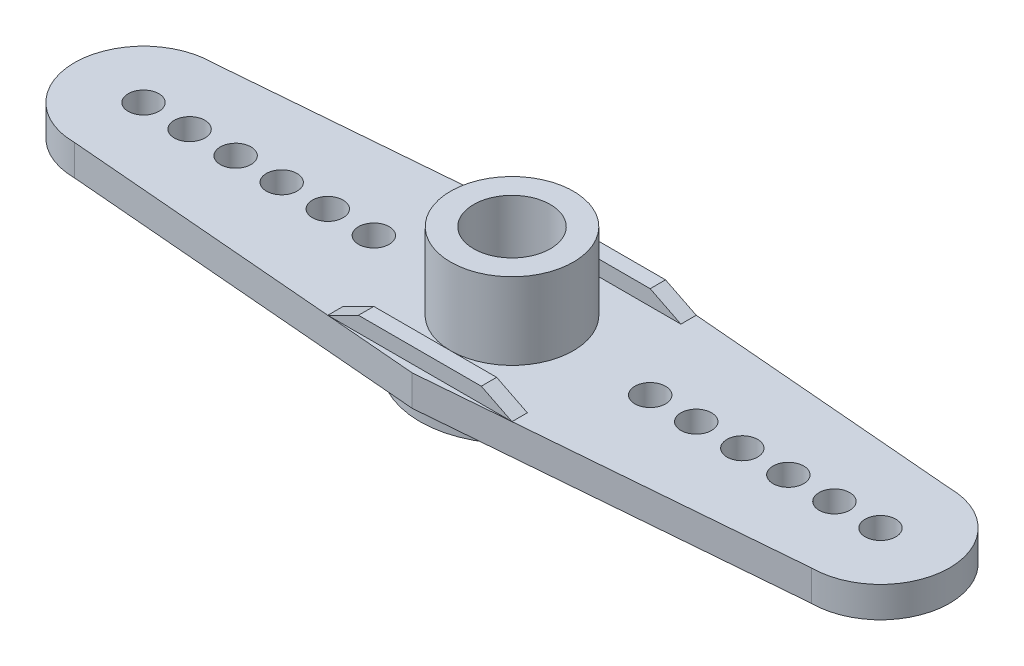
ISO-10303-21;
HEADER;
FILE_DESCRIPTION(('STEP AP214'),'2;1');
FILE_NAME('part.step','',(''),(''),'','','');
FILE_SCHEMA(('AUTOMOTIVE_DESIGN { 1 0 10303 214 1 1 1 1 }'));
ENDSEC;
DATA;
#1=APPLICATION_CONTEXT('core data for automotive mechanical design processes');
#2=APPLICATION_PROTOCOL_DEFINITION('international standard','automotive_design',2000,#1);
#3=PRODUCT_CONTEXT('',#1,'mechanical');
#4=PRODUCT('Part','Part','',(#3));
#5=PRODUCT_RELATED_PRODUCT_CATEGORY('part','',(#4));
#6=PRODUCT_DEFINITION_FORMATION('','',#4);
#7=PRODUCT_DEFINITION_CONTEXT('part definition',#1,'design');
#8=PRODUCT_DEFINITION('design','',#6,#7);
#9=PRODUCT_DEFINITION_SHAPE('','',#8);
#10=(LENGTH_UNIT() NAMED_UNIT(*) SI_UNIT(.MILLI.,.METRE.));
#11=(NAMED_UNIT(*) PLANE_ANGLE_UNIT() SI_UNIT($,.RADIAN.));
#12=(NAMED_UNIT(*) SI_UNIT($,.STERADIAN.) SOLID_ANGLE_UNIT());
#13=UNCERTAINTY_MEASURE_WITH_UNIT(LENGTH_MEASURE(1.E-05),#10,'distance_accuracy_value','');
#14=(GEOMETRIC_REPRESENTATION_CONTEXT(3) GLOBAL_UNCERTAINTY_ASSIGNED_CONTEXT((#13)) GLOBAL_UNIT_ASSIGNED_CONTEXT((#10,
#11,#12)) REPRESENTATION_CONTEXT('',''));
#15=CARTESIAN_POINT('',(0.,0.,0.));
#16=DIRECTION('',(0.,0.,1.));
#17=DIRECTION('',(1.,0.,0.));
#18=AXIS2_PLACEMENT_3D('',#15,#16,#17);
#19=CARTESIAN_POINT('',(0.,2.,0.));
#20=DIRECTION('',(0.,1.,0.));
#21=DIRECTION('',(0.,0.,1.));
#22=AXIS2_PLACEMENT_3D('',#19,#20,#21);
#23=PLANE('',#22);
#24=DIRECTION('',(-0.99654575824488,0.,0.08304547985374));
#25=VECTOR('',#24,1.);
#26=CARTESIAN_POINT('',(0.537931034482759,2.,6.4551724137931));
#27=LINE('',#26,#25);
#28=CARTESIAN_POINT('',(6.,2.,6.));
#29=VERTEX_POINT('',#28);
#30=CARTESIAN_POINT('',(0.,2.,6.5));
#31=VERTEX_POINT('',#30);
#32=EDGE_CURVE('E166',#29,#31,#27,.T.);
#33=ORIENTED_EDGE('',*,*,#32,.F.);
#34=DIRECTION('',(1.,0.,0.));
#35=VECTOR('',#34,1.);
#36=CARTESIAN_POINT('',(-6.,2.,6.));
#37=LINE('',#36,#35);
#38=CARTESIAN_POINT('',(-6.,2.,6.));
#39=VERTEX_POINT('',#38);
#40=EDGE_CURVE('E154',#39,#29,#37,.T.);
#41=ORIENTED_EDGE('',*,*,#40,.F.);
#42=DIRECTION('',(0.99654575824488,0.,0.08304547985374));
#43=VECTOR('',#42,1.);
#44=CARTESIAN_POINT('',(-0.537931034482759,2.,6.4551724137931));
#45=LINE('',#44,#43);
#46=EDGE_CURVE('E164',#39,#31,#45,.T.);
#47=ORIENTED_EDGE('',*,*,#46,.T.);
#48=EDGE_LOOP('',(#33,#41,#47));
#49=FACE_BOUND('',#48,.T.);
#50=ADVANCED_FACE('F35',(#49),#23,.T.);
#51=DIRECTION('',(0.,0.,1.));
#52=VECTOR('',#51,1.);
#53=CARTESIAN_POINT('',(-6.,2.,6.));
#54=LINE('',#53,#52);
#55=CARTESIAN_POINT('',(-6.,2.,5.));
#56=VERTEX_POINT('',#55);
#57=EDGE_CURVE('E134',#56,#39,#54,.T.);
#58=ORIENTED_EDGE('',*,*,#57,.F.);
#59=DIRECTION('',(-1.,0.,0.));
#60=VECTOR('',#59,1.);
#61=CARTESIAN_POINT('',(-6.,2.,5.));
#62=LINE('',#61,#60);
#63=CARTESIAN_POINT('',(6.,2.,5.));
#64=VERTEX_POINT('',#63);
#65=EDGE_CURVE('E146',#64,#56,#62,.T.);
#66=ORIENTED_EDGE('',*,*,#65,.F.);
#67=DIRECTION('',(0.,0.,-1.));
#68=VECTOR('',#67,1.);
#69=CARTESIAN_POINT('',(6.,2.,6.));
#70=LINE('',#69,#68);
#71=EDGE_CURVE('E168',#29,#64,#70,.T.);
#72=ORIENTED_EDGE('',*,*,#71,.F.);
#73=CARTESIAN_POINT('',(24.,2.,4.5));
#74=VERTEX_POINT('',#73);
#75=EDGE_CURVE('E186',#74,#29,#27,.T.);
#76=ORIENTED_EDGE('',*,*,#75,.F.);
#77=CARTESIAN_POINT('',(24.,2.,0.));
#78=DIRECTION('',(0.,1.,0.));
#79=DIRECTION('',(0.,0.,1.));
#80=AXIS2_PLACEMENT_3D('',#77,#78,#79);
#81=CIRCLE('',#80,4.5);
#82=CARTESIAN_POINT('',(24.,2.,-4.5));
#83=VERTEX_POINT('',#82);
#84=EDGE_CURVE('E191',#74,#83,#81,.T.);
#85=ORIENTED_EDGE('',*,*,#84,.T.);
#86=DIRECTION('',(0.99654575824488,0.,0.08304547985374));
#87=VECTOR('',#86,1.);
#88=CARTESIAN_POINT('',(0.537931034482759,2.,-6.4551724137931));
#89=LINE('',#88,#87);
#90=CARTESIAN_POINT('',(6.,2.,-6.));
#91=VERTEX_POINT('',#90);
#92=EDGE_CURVE('E194',#91,#83,#89,.T.);
#93=ORIENTED_EDGE('',*,*,#92,.F.);
#94=DIRECTION('',(0.,0.,-1.));
#95=VECTOR('',#94,1.);
#96=CARTESIAN_POINT('',(6.,2.,-6.));
#97=LINE('',#96,#95);
#98=CARTESIAN_POINT('',(6.,2.,-5.));
#99=VERTEX_POINT('',#98);
#100=EDGE_CURVE('E340',#99,#91,#97,.T.);
#101=ORIENTED_EDGE('',*,*,#100,.F.);
#102=DIRECTION('',(1.,0.,0.));
#103=VECTOR('',#102,1.);
#104=CARTESIAN_POINT('',(-6.,2.,-5.));
#105=LINE('',#104,#103);
#106=CARTESIAN_POINT('',(-6.,2.,-5.));
#107=VERTEX_POINT('',#106);
#108=EDGE_CURVE('E337',#107,#99,#105,.T.);
#109=ORIENTED_EDGE('',*,*,#108,.F.);
#110=DIRECTION('',(0.,0.,1.));
#111=VECTOR('',#110,1.);
#112=CARTESIAN_POINT('',(-6.,2.,-6.));
#113=LINE('',#112,#111);
#114=CARTESIAN_POINT('',(-6.,2.,-6.));
#115=VERTEX_POINT('',#114);
#116=EDGE_CURVE('E321',#115,#107,#113,.T.);
#117=ORIENTED_EDGE('',*,*,#116,.F.);
#118=DIRECTION('',(0.99654575824488,0.,-0.08304547985374));
#119=VECTOR('',#118,1.);
#120=CARTESIAN_POINT('',(-0.537931034482759,2.,-6.4551724137931));
#121=LINE('',#120,#119);
#122=CARTESIAN_POINT('',(-24.,2.,-4.5));
#123=VERTEX_POINT('',#122);
#124=EDGE_CURVE('E199',#123,#115,#121,.T.);
#125=ORIENTED_EDGE('',*,*,#124,.F.);
#126=CARTESIAN_POINT('',(-24.,2.,0.));
#127=DIRECTION('',(0.,1.,0.));
#128=DIRECTION('',(0.,0.,1.));
#129=AXIS2_PLACEMENT_3D('',#126,#127,#128);
#130=CIRCLE('',#129,4.5);
#131=CARTESIAN_POINT('',(-24.,2.,4.5));
#132=VERTEX_POINT('',#131);
#133=EDGE_CURVE('E184',#123,#132,#130,.T.);
#134=ORIENTED_EDGE('',*,*,#133,.T.);
#135=EDGE_CURVE('E176',#132,#39,#45,.T.);
#136=ORIENTED_EDGE('',*,*,#135,.T.);
#137=EDGE_LOOP('',(#58,#66,#72,#76,#85,#93,#101,#109,#117,#125,#134,#136));
#138=FACE_BOUND('',#137,.T.);
#139=CARTESIAN_POINT('',(-12.,2.,0.));
#140=DIRECTION('',(0.,1.,0.));
#141=DIRECTION('',(0.,0.,1.));
#142=AXIS2_PLACEMENT_3D('',#139,#140,#141);
#143=CIRCLE('',#142,1.);
#144=CARTESIAN_POINT('',(-12.,2.,1.00000000000009));
#145=VERTEX_POINT('',#144);
#146=EDGE_CURVE('E287',#145,#145,#143,.F.);
#147=ORIENTED_EDGE('',*,*,#146,.T.);
#148=EDGE_LOOP('',(#147));
#149=FACE_BOUND('',#148,.T.);
#150=CARTESIAN_POINT('',(-18.,2.,0.));
#151=DIRECTION('',(0.,1.,0.));
#152=DIRECTION('',(0.,0.,1.));
#153=AXIS2_PLACEMENT_3D('',#150,#151,#152);
#154=CIRCLE('',#153,0.999999999999998);
#155=CARTESIAN_POINT('',(-18.,2.,1.00000000000004));
#156=VERTEX_POINT('',#155);
#157=EDGE_CURVE('E365',#156,#156,#154,.F.);
#158=ORIENTED_EDGE('',*,*,#157,.T.);
#159=EDGE_LOOP('',(#158));
#160=FACE_BOUND('',#159,.T.);
#161=CARTESIAN_POINT('',(-24.,2.,0.));
#162=DIRECTION('',(0.,1.,0.));
#163=DIRECTION('',(0.,0.,1.));
#164=AXIS2_PLACEMENT_3D('',#161,#162,#163);
#165=CIRCLE('',#164,0.999999999999995);
#166=CARTESIAN_POINT('',(-24.,2.,0.999999999999995));
#167=VERTEX_POINT('',#166);
#168=EDGE_CURVE('E178',#167,#167,#165,.F.);
#169=ORIENTED_EDGE('',*,*,#168,.T.);
#170=EDGE_LOOP('',(#169));
#171=FACE_BOUND('',#170,.T.);
#172=CARTESIAN_POINT('',(-21.,2.,0.));
#173=DIRECTION('',(0.,1.,0.));
#174=DIRECTION('',(0.,0.,1.));
#175=AXIS2_PLACEMENT_3D('',#172,#173,#174);
#176=CIRCLE('',#175,1.);
#177=CARTESIAN_POINT('',(-21.,2.,1.00000000000002));
#178=VERTEX_POINT('',#177);
#179=EDGE_CURVE('E203',#178,#178,#176,.F.);
#180=ORIENTED_EDGE('',*,*,#179,.T.);
#181=EDGE_LOOP('',(#180));
#182=FACE_BOUND('',#181,.T.);
#183=CARTESIAN_POINT('',(-15.,2.,0.));
#184=DIRECTION('',(0.,1.,0.));
#185=DIRECTION('',(0.,0.,1.));
#186=AXIS2_PLACEMENT_3D('',#183,#184,#185);
#187=CIRCLE('',#186,1.);
#188=CARTESIAN_POINT('',(-15.,2.,1.00000000000006));
#189=VERTEX_POINT('',#188);
#190=EDGE_CURVE('E206',#189,#189,#187,.F.);
#191=ORIENTED_EDGE('',*,*,#190,.T.);
#192=EDGE_LOOP('',(#191));
#193=FACE_BOUND('',#192,.T.);
#194=CARTESIAN_POINT('',(-8.99999999999999,2.,1.04744440165294E-13));
#195=DIRECTION('',(0.,1.,0.));
#196=DIRECTION('',(0.,0.,1.));
#197=AXIS2_PLACEMENT_3D('',#194,#195,#196);
#198=CIRCLE('',#197,1.);
#199=CARTESIAN_POINT('',(-8.99999999999999,2.,1.00000000000011));
#200=VERTEX_POINT('',#199);
#201=EDGE_CURVE('E209',#200,#200,#198,.F.);
#202=ORIENTED_EDGE('',*,*,#201,.T.);
#203=EDGE_LOOP('',(#202));
#204=FACE_BOUND('',#203,.T.);
#205=CARTESIAN_POINT('',(24.,2.,0.));
#206=DIRECTION('',(0.,1.,0.));
#207=DIRECTION('',(0.,0.,1.));
#208=AXIS2_PLACEMENT_3D('',#205,#206,#207);
#209=CIRCLE('',#208,1.);
#210=CARTESIAN_POINT('',(24.,2.,1.));
#211=VERTEX_POINT('',#210);
#212=EDGE_CURVE('E230',#211,#211,#209,.T.);
#213=ORIENTED_EDGE('',*,*,#212,.F.);
#214=EDGE_LOOP('',(#213));
#215=FACE_BOUND('',#214,.T.);
#216=CARTESIAN_POINT('',(21.,2.,0.));
#217=DIRECTION('',(0.,1.,0.));
#218=DIRECTION('',(0.,0.,1.));
#219=AXIS2_PLACEMENT_3D('',#216,#217,#218);
#220=CIRCLE('',#219,1.);
#221=CARTESIAN_POINT('',(21.,2.,1.00000000000002));
#222=VERTEX_POINT('',#221);
#223=EDGE_CURVE('E227',#222,#222,#220,.T.);
#224=ORIENTED_EDGE('',*,*,#223,.F.);
#225=EDGE_LOOP('',(#224));
#226=FACE_BOUND('',#225,.T.);
#227=CARTESIAN_POINT('',(18.,2.,0.));
#228=DIRECTION('',(0.,1.,0.));
#229=DIRECTION('',(0.,0.,1.));
#230=AXIS2_PLACEMENT_3D('',#227,#228,#229);
#231=CIRCLE('',#230,0.999999999999998);
#232=CARTESIAN_POINT('',(18.,2.,1.00000000000004));
#233=VERTEX_POINT('',#232);
#234=EDGE_CURVE('E224',#233,#233,#231,.T.);
#235=ORIENTED_EDGE('',*,*,#234,.F.);
#236=EDGE_LOOP('',(#235));
#237=FACE_BOUND('',#236,.T.);
#238=CARTESIAN_POINT('',(15.,2.,0.));
#239=DIRECTION('',(0.,1.,0.));
#240=DIRECTION('',(0.,0.,1.));
#241=AXIS2_PLACEMENT_3D('',#238,#239,#240);
#242=CIRCLE('',#241,1.);
#243=CARTESIAN_POINT('',(15.,2.,1.00000000000006));
#244=VERTEX_POINT('',#243);
#245=EDGE_CURVE('E221',#244,#244,#242,.T.);
#246=ORIENTED_EDGE('',*,*,#245,.F.);
#247=EDGE_LOOP('',(#246));
#248=FACE_BOUND('',#247,.T.);
#249=CARTESIAN_POINT('',(12.,2.,0.));
#250=DIRECTION('',(0.,1.,0.));
#251=DIRECTION('',(0.,0.,1.));
#252=AXIS2_PLACEMENT_3D('',#249,#250,#251);
#253=CIRCLE('',#252,1.);
#254=CARTESIAN_POINT('',(12.,2.,1.00000000000009));
#255=VERTEX_POINT('',#254);
#256=EDGE_CURVE('E218',#255,#255,#253,.T.);
#257=ORIENTED_EDGE('',*,*,#256,.F.);
#258=EDGE_LOOP('',(#257));
#259=FACE_BOUND('',#258,.T.);
#260=CARTESIAN_POINT('',(8.99999999999999,2.,1.04744440165294E-13));
#261=DIRECTION('',(0.,1.,0.));
#262=DIRECTION('',(0.,0.,1.));
#263=AXIS2_PLACEMENT_3D('',#260,#261,#262);
#264=CIRCLE('',#263,1.);
#265=CARTESIAN_POINT('',(8.99999999999999,2.,1.00000000000011));
#266=VERTEX_POINT('',#265);
#267=EDGE_CURVE('E215',#266,#266,#264,.T.);
#268=ORIENTED_EDGE('',*,*,#267,.F.);
#269=EDGE_LOOP('',(#268));
#270=FACE_BOUND('',#269,.T.);
#271=CARTESIAN_POINT('',(0.,2.,0.));
#272=DIRECTION('',(0.,1.,0.));
#273=DIRECTION('',(0.,0.,1.));
#274=AXIS2_PLACEMENT_3D('',#271,#272,#273);
#275=CIRCLE('',#274,4.);
#276=CARTESIAN_POINT('',(0.,2.,4.));
#277=VERTEX_POINT('',#276);
#278=EDGE_CURVE('E359',#277,#277,#275,.T.);
#279=ORIENTED_EDGE('',*,*,#278,.F.);
#280=EDGE_LOOP('',(#279));
#281=FACE_BOUND('',#280,.T.);
#282=ADVANCED_FACE('F180',(#138,#149,#160,#171,#182,#193,#204,#215,#226,#237,#248,#259,#270,
#281),#23,.T.);
#283=CARTESIAN_POINT('',(0.,2.,-6.5));
#284=VERTEX_POINT('',#283);
#285=EDGE_CURVE('E198',#115,#284,#121,.T.);
#286=ORIENTED_EDGE('',*,*,#285,.F.);
#287=DIRECTION('',(-1.,0.,0.));
#288=VECTOR('',#287,1.);
#289=CARTESIAN_POINT('',(-6.,2.,-6.));
#290=LINE('',#289,#288);
#291=EDGE_CURVE('E332',#91,#115,#290,.T.);
#292=ORIENTED_EDGE('',*,*,#291,.F.);
#293=EDGE_CURVE('E195',#284,#91,#89,.T.);
#294=ORIENTED_EDGE('',*,*,#293,.F.);
#295=EDGE_LOOP('',(#286,#292,#294));
#296=FACE_BOUND('',#295,.T.);
#297=ADVANCED_FACE('F426',(#296),#23,.T.);
#298=CARTESIAN_POINT('',(0.,2.,0.));
#299=DIRECTION('',(0.,-1.,0.));
#300=DIRECTION('',(0.,0.,-1.));
#301=AXIS2_PLACEMENT_3D('',#298,#299,#300);
#302=CYLINDRICAL_SURFACE('',#301,1.5);
#303=CARTESIAN_POINT('',(0.,2.,0.));
#304=DIRECTION('',(0.,1.,0.));
#305=DIRECTION('',(0.,0.,1.));
#306=AXIS2_PLACEMENT_3D('',#303,#304,#305);
#307=CIRCLE('',#306,1.5);
#308=CARTESIAN_POINT('',(0.,2.,1.5));
#309=VERTEX_POINT('',#308);
#310=EDGE_CURVE('E212',#309,#309,#307,.T.);
#311=ORIENTED_EDGE('',*,*,#310,.T.);
#312=EDGE_LOOP('',(#311));
#313=FACE_BOUND('',#312,.T.);
#314=CARTESIAN_POINT('',(0.,1.,0.));
#315=DIRECTION('',(0.,-1.,0.));
#316=DIRECTION('',(0.,0.,-1.));
#317=AXIS2_PLACEMENT_3D('',#314,#315,#316);
#318=CIRCLE('',#317,1.5);
#319=CARTESIAN_POINT('',(0.,1.,-1.5));
#320=VERTEX_POINT('',#319);
#321=EDGE_CURVE('E304',#320,#320,#318,.T.);
#322=ORIENTED_EDGE('',*,*,#321,.T.);
#323=EDGE_LOOP('',(#322));
#324=FACE_BOUND('',#323,.T.);
#325=ADVANCED_FACE('F437',(#313,#324),#302,.F.);
#326=CARTESIAN_POINT('',(0.,0.,0.));
#327=DIRECTION('',(0.,1.,0.));
#328=DIRECTION('',(0.,0.,1.));
#329=AXIS2_PLACEMENT_3D('',#326,#327,#328);
#330=PLANE('',#329);
#331=CARTESIAN_POINT('',(0.,0.,0.));
#332=DIRECTION('',(0.,-1.,0.));
#333=DIRECTION('',(0.,0.,-1.));
#334=AXIS2_PLACEMENT_3D('',#331,#332,#333);
#335=CIRCLE('',#334,3.5);
#336=CARTESIAN_POINT('',(0.,0.,-3.5));
#337=VERTEX_POINT('',#336);
#338=EDGE_CURVE('E335',#337,#337,#335,.T.);
#339=ORIENTED_EDGE('',*,*,#338,.F.);
#340=EDGE_LOOP('',(#339));
#341=FACE_BOUND('',#340,.T.);
#342=CARTESIAN_POINT('',(0.,0.,0.));
#343=DIRECTION('',(0.,-1.,0.));
#344=DIRECTION('',(0.,0.,-1.));
#345=AXIS2_PLACEMENT_3D('',#342,#343,#344);
#346=CIRCLE('',#345,4.);
#347=CARTESIAN_POINT('',(0.,0.,-4.));
#348=VERTEX_POINT('',#347);
#349=EDGE_CURVE('E306',#348,#348,#346,.T.);
#350=ORIENTED_EDGE('',*,*,#349,.T.);
#351=EDGE_LOOP('',(#350));
#352=FACE_BOUND('',#351,.T.);
#353=ADVANCED_FACE('F389',(#341,#352),#330,.F.);
#354=ORIENTED_EDGE('',*,*,#310,.F.);
#355=EDGE_LOOP('',(#354));
#356=FACE_BOUND('',#355,.T.);
#357=CARTESIAN_POINT('',(0.,2.,0.));
#358=DIRECTION('',(0.,1.,0.));
#359=DIRECTION('',(0.,0.,1.));
#360=AXIS2_PLACEMENT_3D('',#357,#358,#359);
#361=CIRCLE('',#360,2.5);
#362=CARTESIAN_POINT('',(0.,2.,2.5));
#363=VERTEX_POINT('',#362);
#364=EDGE_CURVE('E298',#363,#363,#361,.F.);
#365=ORIENTED_EDGE('',*,*,#364,.F.);
#366=EDGE_LOOP('',(#365));
#367=FACE_BOUND('',#366,.T.);
#368=ADVANCED_FACE('F421',(#356,#367),#23,.T.);
#369=CARTESIAN_POINT('',(-0.537931034482759,2.,6.4551724137931));
#370=DIRECTION('',(0.08304547985374,0.,-0.99654575824488));
#371=DIRECTION('',(-0.99654575824488,0.,-0.08304547985374));
#372=AXIS2_PLACEMENT_3D('',#369,#370,#371);
#373=PLANE('',#372);
#374=DIRECTION('',(0.99654575824488,0.,0.08304547985374));
#375=VECTOR('',#374,1.);
#376=CARTESIAN_POINT('',(-0.537931034482759,0.,6.4551724137931));
#377=LINE('',#376,#375);
#378=CARTESIAN_POINT('',(-24.,0.,4.5));
#379=VERTEX_POINT('',#378);
#380=CARTESIAN_POINT('',(0.,0.,6.5));
#381=VERTEX_POINT('',#380);
#382=EDGE_CURVE('E244',#379,#381,#377,.T.);
#383=ORIENTED_EDGE('',*,*,#382,.T.);
#384=DIRECTION('',(0.,-1.,0.));
#385=VECTOR('',#384,1.);
#386=CARTESIAN_POINT('',(0.,2.,6.5));
#387=LINE('',#386,#385);
#388=EDGE_CURVE('E177',#31,#381,#387,.T.);
#389=ORIENTED_EDGE('',*,*,#388,.F.);
#390=ORIENTED_EDGE('',*,*,#46,.F.);
#391=ORIENTED_EDGE('',*,*,#135,.F.);
#392=DIRECTION('',(0.,-1.,0.));
#393=VECTOR('',#392,1.);
#394=CARTESIAN_POINT('',(-24.,2.,4.5));
#395=LINE('',#394,#393);
#396=EDGE_CURVE('E233',#132,#379,#395,.T.);
#397=ORIENTED_EDGE('',*,*,#396,.T.);
#398=EDGE_LOOP('',(#383,#389,#390,#391,#397));
#399=FACE_BOUND('',#398,.T.);
#400=ADVANCED_FACE('F174',(#399),#373,.F.);
#401=CARTESIAN_POINT('',(0.537931034482759,2.,6.4551724137931));
#402=DIRECTION('',(0.08304547985374,0.,0.99654575824488));
#403=DIRECTION('',(0.99654575824488,0.,-0.08304547985374));
#404=AXIS2_PLACEMENT_3D('',#401,#402,#403);
#405=PLANE('',#404);
#406=DIRECTION('',(-0.99654575824488,0.,0.08304547985374));
#407=VECTOR('',#406,1.);
#408=CARTESIAN_POINT('',(0.537931034482759,0.,6.4551724137931));
#409=LINE('',#408,#407);
#410=CARTESIAN_POINT('',(24.,0.,4.5));
#411=VERTEX_POINT('',#410);
#412=EDGE_CURVE('E246',#411,#381,#409,.T.);
#413=ORIENTED_EDGE('',*,*,#412,.F.);
#414=DIRECTION('',(0.,-1.,0.));
#415=VECTOR('',#414,1.);
#416=CARTESIAN_POINT('',(24.,2.,4.5));
#417=LINE('',#416,#415);
#418=EDGE_CURVE('E295',#74,#411,#417,.T.);
#419=ORIENTED_EDGE('',*,*,#418,.F.);
#420=ORIENTED_EDGE('',*,*,#75,.T.);
#421=ORIENTED_EDGE('',*,*,#32,.T.);
#422=ORIENTED_EDGE('',*,*,#388,.T.);
#423=EDGE_LOOP('',(#413,#419,#420,#421,#422));
#424=FACE_BOUND('',#423,.T.);
#425=ADVANCED_FACE('F435',(#424),#405,.T.);
#426=CARTESIAN_POINT('',(24.,2.,0.));
#427=DIRECTION('',(0.,-1.,0.));
#428=DIRECTION('',(0.,0.,-1.));
#429=AXIS2_PLACEMENT_3D('',#426,#427,#428);
#430=CYLINDRICAL_SURFACE('',#429,4.5);
#431=CARTESIAN_POINT('',(24.,0.,0.));
#432=DIRECTION('',(0.,1.,0.));
#433=DIRECTION('',(0.,0.,1.));
#434=AXIS2_PLACEMENT_3D('',#431,#432,#433);
#435=CIRCLE('',#434,4.5);
#436=CARTESIAN_POINT('',(24.,0.,-4.5));
#437=VERTEX_POINT('',#436);
#438=EDGE_CURVE('E249',#411,#437,#435,.T.);
#439=ORIENTED_EDGE('',*,*,#438,.T.);
#440=DIRECTION('',(0.,-1.,0.));
#441=VECTOR('',#440,1.);
#442=CARTESIAN_POINT('',(24.,2.,-4.5));
#443=LINE('',#442,#441);
#444=EDGE_CURVE('E293',#83,#437,#443,.T.);
#445=ORIENTED_EDGE('',*,*,#444,.F.);
#446=ORIENTED_EDGE('',*,*,#84,.F.);
#447=ORIENTED_EDGE('',*,*,#418,.T.);
#448=EDGE_LOOP('',(#439,#445,#446,#447));
#449=FACE_BOUND('',#448,.T.);
#450=ADVANCED_FACE('F810',(#449),#430,.T.);
#451=CARTESIAN_POINT('',(0.537931034482759,2.,-6.4551724137931));
#452=DIRECTION('',(0.08304547985374,0.,-0.99654575824488));
#453=DIRECTION('',(-0.99654575824488,0.,-0.08304547985374));
#454=AXIS2_PLACEMENT_3D('',#451,#452,#453);
#455=PLANE('',#454);
#456=DIRECTION('',(0.99654575824488,0.,0.08304547985374));
#457=VECTOR('',#456,1.);
#458=CARTESIAN_POINT('',(0.537931034482759,0.,-6.4551724137931));
#459=LINE('',#458,#457);
#460=CARTESIAN_POINT('',(0.,0.,-6.5));
#461=VERTEX_POINT('',#460);
#462=EDGE_CURVE('E252',#461,#437,#459,.T.);
#463=ORIENTED_EDGE('',*,*,#462,.F.);
#464=DIRECTION('',(0.,-1.,0.));
#465=VECTOR('',#464,1.);
#466=CARTESIAN_POINT('',(0.,2.,-6.5));
#467=LINE('',#466,#465);
#468=EDGE_CURVE('E291',#284,#461,#467,.T.);
#469=ORIENTED_EDGE('',*,*,#468,.F.);
#470=ORIENTED_EDGE('',*,*,#293,.T.);
#471=ORIENTED_EDGE('',*,*,#92,.T.);
#472=ORIENTED_EDGE('',*,*,#444,.T.);
#473=EDGE_LOOP('',(#463,#469,#470,#471,#472));
#474=FACE_BOUND('',#473,.T.);
#475=ADVANCED_FACE('F491',(#474),#455,.T.);
#476=CARTESIAN_POINT('',(-0.537931034482759,2.,-6.4551724137931));
#477=DIRECTION('',(-0.08304547985374,0.,-0.99654575824488));
#478=DIRECTION('',(-0.99654575824488,0.,0.08304547985374));
#479=AXIS2_PLACEMENT_3D('',#476,#477,#478);
#480=PLANE('',#479);
#481=DIRECTION('',(0.99654575824488,0.,-0.08304547985374));
#482=VECTOR('',#481,1.);
#483=CARTESIAN_POINT('',(-0.537931034482759,0.,-6.4551724137931));
#484=LINE('',#483,#482);
#485=CARTESIAN_POINT('',(-24.,0.,-4.5));
#486=VERTEX_POINT('',#485);
#487=EDGE_CURVE('E255',#486,#461,#484,.T.);
#488=ORIENTED_EDGE('',*,*,#487,.F.);
#489=DIRECTION('',(0.,-1.,0.));
#490=VECTOR('',#489,1.);
#491=CARTESIAN_POINT('',(-24.,2.,-4.5));
#492=LINE('',#491,#490);
#493=EDGE_CURVE('E289',#123,#486,#492,.T.);
#494=ORIENTED_EDGE('',*,*,#493,.F.);
#495=ORIENTED_EDGE('',*,*,#124,.T.);
#496=ORIENTED_EDGE('',*,*,#285,.T.);
#497=ORIENTED_EDGE('',*,*,#468,.T.);
#498=EDGE_LOOP('',(#488,#494,#495,#496,#497));
#499=FACE_BOUND('',#498,.T.);
#500=ADVANCED_FACE('F455',(#499),#480,.T.);
#501=CARTESIAN_POINT('',(21.,2.,0.));
#502=DIRECTION('',(0.,-1.,0.));
#503=DIRECTION('',(0.,0.,-1.));
#504=AXIS2_PLACEMENT_3D('',#501,#502,#503);
#505=CYLINDRICAL_SURFACE('',#504,1.);
#506=ORIENTED_EDGE('',*,*,#223,.T.);
#507=EDGE_LOOP('',(#506));
#508=FACE_BOUND('',#507,.T.);
#509=CARTESIAN_POINT('',(21.,0.,0.));
#510=DIRECTION('',(0.,1.,0.));
#511=DIRECTION('',(0.,0.,1.));
#512=AXIS2_PLACEMENT_3D('',#509,#510,#511);
#513=CIRCLE('',#512,1.);
#514=CARTESIAN_POINT('',(21.,0.,1.00000000000002));
#515=VERTEX_POINT('',#514);
#516=EDGE_CURVE('E281',#515,#515,#513,.T.);
#517=ORIENTED_EDGE('',*,*,#516,.F.);
#518=EDGE_LOOP('',(#517));
#519=FACE_BOUND('',#518,.T.);
#520=ADVANCED_FACE('F795',(#508,#519),#505,.F.);
#521=CARTESIAN_POINT('',(18.,2.,0.));
#522=DIRECTION('',(0.,-1.,0.));
#523=DIRECTION('',(0.,0.,-1.));
#524=AXIS2_PLACEMENT_3D('',#521,#522,#523);
#525=CYLINDRICAL_SURFACE('',#524,0.999999999999998);
#526=ORIENTED_EDGE('',*,*,#234,.T.);
#527=EDGE_LOOP('',(#526));
#528=FACE_BOUND('',#527,.T.);
#529=CARTESIAN_POINT('',(18.,0.,0.));
#530=DIRECTION('',(0.,1.,0.));
#531=DIRECTION('',(0.,0.,1.));
#532=AXIS2_PLACEMENT_3D('',#529,#530,#531);
#533=CIRCLE('',#532,0.999999999999998);
#534=CARTESIAN_POINT('',(18.,0.,1.00000000000004));
#535=VERTEX_POINT('',#534);
#536=EDGE_CURVE('E278',#535,#535,#533,.T.);
#537=ORIENTED_EDGE('',*,*,#536,.F.);
#538=EDGE_LOOP('',(#537));
#539=FACE_BOUND('',#538,.T.);
#540=ADVANCED_FACE('F785',(#528,#539),#525,.F.);
#541=CARTESIAN_POINT('',(15.,2.,0.));
#542=DIRECTION('',(0.,-1.,0.));
#543=DIRECTION('',(0.,0.,-1.));
#544=AXIS2_PLACEMENT_3D('',#541,#542,#543);
#545=CYLINDRICAL_SURFACE('',#544,1.);
#546=ORIENTED_EDGE('',*,*,#245,.T.);
#547=EDGE_LOOP('',(#546));
#548=FACE_BOUND('',#547,.T.);
#549=CARTESIAN_POINT('',(15.,0.,0.));
#550=DIRECTION('',(0.,1.,0.));
#551=DIRECTION('',(0.,0.,1.));
#552=AXIS2_PLACEMENT_3D('',#549,#550,#551);
#553=CIRCLE('',#552,1.);
#554=CARTESIAN_POINT('',(15.,0.,1.00000000000006));
#555=VERTEX_POINT('',#554);
#556=EDGE_CURVE('E275',#555,#555,#553,.T.);
#557=ORIENTED_EDGE('',*,*,#556,.F.);
#558=EDGE_LOOP('',(#557));
#559=FACE_BOUND('',#558,.T.);
#560=ADVANCED_FACE('F775',(#548,#559),#545,.F.);
#561=CARTESIAN_POINT('',(12.,2.,0.));
#562=DIRECTION('',(0.,-1.,0.));
#563=DIRECTION('',(0.,0.,-1.));
#564=AXIS2_PLACEMENT_3D('',#561,#562,#563);
#565=CYLINDRICAL_SURFACE('',#564,1.);
#566=ORIENTED_EDGE('',*,*,#256,.T.);
#567=EDGE_LOOP('',(#566));
#568=FACE_BOUND('',#567,.T.);
#569=CARTESIAN_POINT('',(12.,0.,0.));
#570=DIRECTION('',(0.,1.,0.));
#571=DIRECTION('',(0.,0.,1.));
#572=AXIS2_PLACEMENT_3D('',#569,#570,#571);
#573=CIRCLE('',#572,1.);
#574=CARTESIAN_POINT('',(12.,0.,1.00000000000009));
#575=VERTEX_POINT('',#574);
#576=EDGE_CURVE('E272',#575,#575,#573,.T.);
#577=ORIENTED_EDGE('',*,*,#576,.F.);
#578=EDGE_LOOP('',(#577));
#579=FACE_BOUND('',#578,.T.);
#580=ADVANCED_FACE('F765',(#568,#579),#565,.F.);
#581=CARTESIAN_POINT('',(8.99999999999999,2.,1.04744440165294E-13));
#582=DIRECTION('',(0.,-1.,0.));
#583=DIRECTION('',(0.,0.,-1.));
#584=AXIS2_PLACEMENT_3D('',#581,#582,#583);
#585=CYLINDRICAL_SURFACE('',#584,1.);
#586=ORIENTED_EDGE('',*,*,#267,.T.);
#587=EDGE_LOOP('',(#586));
#588=FACE_BOUND('',#587,.T.);
#589=CARTESIAN_POINT('',(8.99999999999999,0.,1.04744440165294E-13));
#590=DIRECTION('',(0.,1.,0.));
#591=DIRECTION('',(0.,0.,1.));
#592=AXIS2_PLACEMENT_3D('',#589,#590,#591);
#593=CIRCLE('',#592,1.);
#594=CARTESIAN_POINT('',(8.99999999999999,0.,1.00000000000011));
#595=VERTEX_POINT('',#594);
#596=EDGE_CURVE('E269',#595,#595,#593,.T.);
#597=ORIENTED_EDGE('',*,*,#596,.F.);
#598=EDGE_LOOP('',(#597));
#599=FACE_BOUND('',#598,.T.);
#600=ADVANCED_FACE('F755',(#588,#599),#585,.F.);
#601=CARTESIAN_POINT('',(-8.99999999999999,2.,1.04744440165294E-13));
#602=DIRECTION('',(0.,-1.,0.));
#603=DIRECTION('',(0.,0.,-1.));
#604=AXIS2_PLACEMENT_3D('',#601,#602,#603);
#605=CYLINDRICAL_SURFACE('',#604,1.);
#606=ORIENTED_EDGE('',*,*,#201,.F.);
#607=EDGE_LOOP('',(#606));
#608=FACE_BOUND('',#607,.T.);
#609=CARTESIAN_POINT('',(-8.99999999999999,0.,1.04744440165294E-13));
#610=DIRECTION('',(0.,1.,0.));
#611=DIRECTION('',(0.,0.,1.));
#612=AXIS2_PLACEMENT_3D('',#609,#610,#611);
#613=CIRCLE('',#612,1.);
#614=CARTESIAN_POINT('',(-8.99999999999999,0.,1.00000000000011));
#615=VERTEX_POINT('',#614);
#616=EDGE_CURVE('E266',#615,#615,#613,.F.);
#617=ORIENTED_EDGE('',*,*,#616,.T.);
#618=EDGE_LOOP('',(#617));
#619=FACE_BOUND('',#618,.T.);
#620=ADVANCED_FACE('F745',(#608,#619),#605,.F.);
#621=CARTESIAN_POINT('',(-15.,2.,0.));
#622=DIRECTION('',(0.,-1.,0.));
#623=DIRECTION('',(0.,0.,-1.));
#624=AXIS2_PLACEMENT_3D('',#621,#622,#623);
#625=CYLINDRICAL_SURFACE('',#624,1.);
#626=ORIENTED_EDGE('',*,*,#190,.F.);
#627=EDGE_LOOP('',(#626));
#628=FACE_BOUND('',#627,.T.);
#629=CARTESIAN_POINT('',(-15.,0.,0.));
#630=DIRECTION('',(0.,1.,0.));
#631=DIRECTION('',(0.,0.,1.));
#632=AXIS2_PLACEMENT_3D('',#629,#630,#631);
#633=CIRCLE('',#632,1.);
#634=CARTESIAN_POINT('',(-15.,0.,1.00000000000006));
#635=VERTEX_POINT('',#634);
#636=EDGE_CURVE('E263',#635,#635,#633,.F.);
#637=ORIENTED_EDGE('',*,*,#636,.T.);
#638=EDGE_LOOP('',(#637));
#639=FACE_BOUND('',#638,.T.);
#640=ADVANCED_FACE('F735',(#628,#639),#625,.F.);
#641=CARTESIAN_POINT('',(-21.,2.,0.));
#642=DIRECTION('',(0.,-1.,0.));
#643=DIRECTION('',(0.,0.,-1.));
#644=AXIS2_PLACEMENT_3D('',#641,#642,#643);
#645=CYLINDRICAL_SURFACE('',#644,1.);
#646=ORIENTED_EDGE('',*,*,#179,.F.);
#647=EDGE_LOOP('',(#646));
#648=FACE_BOUND('',#647,.T.);
#649=CARTESIAN_POINT('',(-21.,0.,0.));
#650=DIRECTION('',(0.,1.,0.));
#651=DIRECTION('',(0.,0.,1.));
#652=AXIS2_PLACEMENT_3D('',#649,#650,#651);
#653=CIRCLE('',#652,1.);
#654=CARTESIAN_POINT('',(-21.,0.,1.00000000000002));
#655=VERTEX_POINT('',#654);
#656=EDGE_CURVE('E260',#655,#655,#653,.F.);
#657=ORIENTED_EDGE('',*,*,#656,.T.);
#658=EDGE_LOOP('',(#657));
#659=FACE_BOUND('',#658,.T.);
#660=ADVANCED_FACE('F726',(#648,#659),#645,.F.);
#661=CARTESIAN_POINT('',(-24.,2.,0.));
#662=DIRECTION('',(0.,-1.,0.));
#663=DIRECTION('',(0.,0.,-1.));
#664=AXIS2_PLACEMENT_3D('',#661,#662,#663);
#665=CYLINDRICAL_SURFACE('',#664,4.5);
#666=CARTESIAN_POINT('',(-24.,0.,0.));
#667=DIRECTION('',(0.,1.,0.));
#668=DIRECTION('',(0.,0.,1.));
#669=AXIS2_PLACEMENT_3D('',#666,#667,#668);
#670=CIRCLE('',#669,4.5);
#671=EDGE_CURVE('E258',#486,#379,#670,.T.);
#672=ORIENTED_EDGE('',*,*,#671,.T.);
#673=ORIENTED_EDGE('',*,*,#396,.F.);
#674=ORIENTED_EDGE('',*,*,#133,.F.);
#675=ORIENTED_EDGE('',*,*,#493,.T.);
#676=EDGE_LOOP('',(#672,#673,#674,#675));
#677=FACE_BOUND('',#676,.T.);
#678=ADVANCED_FACE('F378',(#677),#665,.T.);
#679=CARTESIAN_POINT('',(-24.,2.,0.));
#680=DIRECTION('',(0.,-1.,0.));
#681=DIRECTION('',(0.,0.,-1.));
#682=AXIS2_PLACEMENT_3D('',#679,#680,#681);
#683=CYLINDRICAL_SURFACE('',#682,0.999999999999995);
#684=ORIENTED_EDGE('',*,*,#168,.F.);
#685=EDGE_LOOP('',(#684));
#686=FACE_BOUND('',#685,.T.);
#687=CARTESIAN_POINT('',(-24.,0.,0.));
#688=DIRECTION('',(0.,1.,0.));
#689=DIRECTION('',(0.,0.,1.));
#690=AXIS2_PLACEMENT_3D('',#687,#688,#689);
#691=CIRCLE('',#690,0.999999999999995);
#692=CARTESIAN_POINT('',(-24.,0.,0.999999999999995));
#693=VERTEX_POINT('',#692);
#694=EDGE_CURVE('E241',#693,#693,#691,.F.);
#695=ORIENTED_EDGE('',*,*,#694,.T.);
#696=EDGE_LOOP('',(#695));
#697=FACE_BOUND('',#696,.T.);
#698=ADVANCED_FACE('F374',(#686,#697),#683,.F.);
#699=CARTESIAN_POINT('',(-18.,2.,0.));
#700=DIRECTION('',(0.,-1.,0.));
#701=DIRECTION('',(0.,0.,-1.));
#702=AXIS2_PLACEMENT_3D('',#699,#700,#701);
#703=CYLINDRICAL_SURFACE('',#702,0.999999999999998);
#704=ORIENTED_EDGE('',*,*,#157,.F.);
#705=EDGE_LOOP('',(#704));
#706=FACE_BOUND('',#705,.T.);
#707=CARTESIAN_POINT('',(-18.,0.,0.));
#708=DIRECTION('',(0.,1.,0.));
#709=DIRECTION('',(0.,0.,1.));
#710=AXIS2_PLACEMENT_3D('',#707,#708,#709);
#711=CIRCLE('',#710,0.999999999999998);
#712=CARTESIAN_POINT('',(-18.,0.,1.00000000000004));
#713=VERTEX_POINT('',#712);
#714=EDGE_CURVE('E237',#713,#713,#711,.F.);
#715=ORIENTED_EDGE('',*,*,#714,.T.);
#716=EDGE_LOOP('',(#715));
#717=FACE_BOUND('',#716,.T.);
#718=ADVANCED_FACE('F377',(#706,#717),#703,.F.);
#719=CARTESIAN_POINT('',(-12.,2.,0.));
#720=DIRECTION('',(0.,-1.,0.));
#721=DIRECTION('',(0.,0.,-1.));
#722=AXIS2_PLACEMENT_3D('',#719,#720,#721);
#723=CYLINDRICAL_SURFACE('',#722,1.);
#724=ORIENTED_EDGE('',*,*,#146,.F.);
#725=EDGE_LOOP('',(#724));
#726=FACE_BOUND('',#725,.T.);
#727=CARTESIAN_POINT('',(-12.,0.,0.));
#728=DIRECTION('',(0.,1.,0.));
#729=DIRECTION('',(0.,0.,1.));
#730=AXIS2_PLACEMENT_3D('',#727,#728,#729);
#731=CIRCLE('',#730,1.);
#732=CARTESIAN_POINT('',(-12.,0.,1.00000000000009));
#733=VERTEX_POINT('',#732);
#734=EDGE_CURVE('E234',#733,#733,#731,.F.);
#735=ORIENTED_EDGE('',*,*,#734,.T.);
#736=EDGE_LOOP('',(#735));
#737=FACE_BOUND('',#736,.T.);
#738=ADVANCED_FACE('F37',(#726,#737),#723,.F.);
#739=CARTESIAN_POINT('',(24.,2.,0.));
#740=DIRECTION('',(0.,-1.,0.));
#741=DIRECTION('',(0.,0.,-1.));
#742=AXIS2_PLACEMENT_3D('',#739,#740,#741);
#743=CYLINDRICAL_SURFACE('',#742,1.);
#744=ORIENTED_EDGE('',*,*,#212,.T.);
#745=EDGE_LOOP('',(#744));
#746=FACE_BOUND('',#745,.T.);
#747=CARTESIAN_POINT('',(24.,0.,0.));
#748=DIRECTION('',(0.,1.,0.));
#749=DIRECTION('',(0.,0.,1.));
#750=AXIS2_PLACEMENT_3D('',#747,#748,#749);
#751=CIRCLE('',#750,1.);
#752=CARTESIAN_POINT('',(24.,0.,1.));
#753=VERTEX_POINT('',#752);
#754=EDGE_CURVE('E284',#753,#753,#751,.T.);
#755=ORIENTED_EDGE('',*,*,#754,.F.);
#756=EDGE_LOOP('',(#755));
#757=FACE_BOUND('',#756,.T.);
#758=ADVANCED_FACE('F386',(#746,#757),#743,.F.);
#759=CARTESIAN_POINT('',(0.,0.,0.));
#760=DIRECTION('',(0.,1.,0.));
#761=DIRECTION('',(0.,0.,1.));
#762=AXIS2_PLACEMENT_3D('',#759,#760,#761);
#763=CIRCLE('',#762,6.);
#764=CARTESIAN_POINT('',(0.,0.,6.));
#765=VERTEX_POINT('',#764);
#766=EDGE_CURVE('E301',#765,#765,#763,.F.);
#767=ORIENTED_EDGE('',*,*,#766,.F.);
#768=EDGE_LOOP('',(#767));
#769=FACE_BOUND('',#768,.T.);
#770=ORIENTED_EDGE('',*,*,#734,.F.);
#771=EDGE_LOOP('',(#770));
#772=FACE_BOUND('',#771,.T.);
#773=ORIENTED_EDGE('',*,*,#714,.F.);
#774=EDGE_LOOP('',(#773));
#775=FACE_BOUND('',#774,.T.);
#776=ORIENTED_EDGE('',*,*,#694,.F.);
#777=EDGE_LOOP('',(#776));
#778=FACE_BOUND('',#777,.T.);
#779=ORIENTED_EDGE('',*,*,#382,.F.);
#780=ORIENTED_EDGE('',*,*,#671,.F.);
#781=ORIENTED_EDGE('',*,*,#487,.T.);
#782=ORIENTED_EDGE('',*,*,#462,.T.);
#783=ORIENTED_EDGE('',*,*,#438,.F.);
#784=ORIENTED_EDGE('',*,*,#412,.T.);
#785=EDGE_LOOP('',(#779,#780,#781,#782,#783,#784));
#786=FACE_BOUND('',#785,.T.);
#787=ORIENTED_EDGE('',*,*,#656,.F.);
#788=EDGE_LOOP('',(#787));
#789=FACE_BOUND('',#788,.T.);
#790=ORIENTED_EDGE('',*,*,#636,.F.);
#791=EDGE_LOOP('',(#790));
#792=FACE_BOUND('',#791,.T.);
#793=ORIENTED_EDGE('',*,*,#616,.F.);
#794=EDGE_LOOP('',(#793));
#795=FACE_BOUND('',#794,.T.);
#796=ORIENTED_EDGE('',*,*,#596,.T.);
#797=EDGE_LOOP('',(#796));
#798=FACE_BOUND('',#797,.T.);
#799=ORIENTED_EDGE('',*,*,#576,.T.);
#800=EDGE_LOOP('',(#799));
#801=FACE_BOUND('',#800,.T.);
#802=ORIENTED_EDGE('',*,*,#556,.T.);
#803=EDGE_LOOP('',(#802));
#804=FACE_BOUND('',#803,.T.);
#805=ORIENTED_EDGE('',*,*,#536,.T.);
#806=EDGE_LOOP('',(#805));
#807=FACE_BOUND('',#806,.T.);
#808=ORIENTED_EDGE('',*,*,#516,.T.);
#809=EDGE_LOOP('',(#808));
#810=FACE_BOUND('',#809,.T.);
#811=ORIENTED_EDGE('',*,*,#754,.T.);
#812=EDGE_LOOP('',(#811));
#813=FACE_BOUND('',#812,.T.);
#814=ADVANCED_FACE('F382',(#769,#772,#775,#778,#786,#789,#792,#795,#798,#801,#804,#807,#810,
#813),#330,.F.);
#815=CARTESIAN_POINT('',(0.,7.,0.));
#816=DIRECTION('',(0.,1.,0.));
#817=DIRECTION('',(0.,0.,1.));
#818=AXIS2_PLACEMENT_3D('',#815,#816,#817);
#819=PLANE('',#818);
#820=CARTESIAN_POINT('',(0.,7.,0.));
#821=DIRECTION('',(0.,1.,0.));
#822=DIRECTION('',(0.,0.,1.));
#823=AXIS2_PLACEMENT_3D('',#820,#821,#822);
#824=CIRCLE('',#823,4.);
#825=CARTESIAN_POINT('',(0.,7.,4.));
#826=VERTEX_POINT('',#825);
#827=EDGE_CURVE('E238',#826,#826,#824,.T.);
#828=ORIENTED_EDGE('',*,*,#827,.T.);
#829=EDGE_LOOP('',(#828));
#830=FACE_BOUND('',#829,.T.);
#831=CARTESIAN_POINT('',(0.,7.,0.));
#832=DIRECTION('',(0.,1.,0.));
#833=DIRECTION('',(0.,0.,1.));
#834=AXIS2_PLACEMENT_3D('',#831,#832,#833);
#835=CIRCLE('',#834,2.5);
#836=CARTESIAN_POINT('',(0.,7.,2.5));
#837=VERTEX_POINT('',#836);
#838=EDGE_CURVE('E356',#837,#837,#835,.T.);
#839=ORIENTED_EDGE('',*,*,#838,.F.);
#840=EDGE_LOOP('',(#839));
#841=FACE_BOUND('',#840,.T.);
#842=ADVANCED_FACE('F385',(#830,#841),#819,.T.);
#843=CARTESIAN_POINT('',(0.,7.,0.));
#844=DIRECTION('',(0.,-1.,0.));
#845=DIRECTION('',(0.,0.,-1.));
#846=AXIS2_PLACEMENT_3D('',#843,#844,#845);
#847=CYLINDRICAL_SURFACE('',#846,4.);
#848=CARTESIAN_POINT('',(-4.,3.,0.));
#849=VERTEX_POINT('',#848);
#850=VERTEX_LOOP('',#849);
#851=FACE_BOUND('',#850,.T.);
#852=CARTESIAN_POINT('',(4.,3.,0.));
#853=VERTEX_POINT('',#852);
#854=VERTEX_LOOP('',#853);
#855=FACE_BOUND('',#854,.T.);
#856=ORIENTED_EDGE('',*,*,#827,.F.);
#857=EDGE_LOOP('',(#856));
#858=FACE_BOUND('',#857,.T.);
#859=ORIENTED_EDGE('',*,*,#278,.T.);
#860=EDGE_LOOP('',(#859));
#861=FACE_BOUND('',#860,.T.);
#862=ADVANCED_FACE('F537',(#851,#855,#858,#861),#847,.T.);
#863=CARTESIAN_POINT('',(0.,7.,0.));
#864=DIRECTION('',(0.,-1.,0.));
#865=DIRECTION('',(0.,0.,-1.));
#866=AXIS2_PLACEMENT_3D('',#863,#864,#865);
#867=CYLINDRICAL_SURFACE('',#866,2.5);
#868=ORIENTED_EDGE('',*,*,#838,.T.);
#869=EDGE_LOOP('',(#868));
#870=FACE_BOUND('',#869,.T.);
#871=ORIENTED_EDGE('',*,*,#364,.T.);
#872=EDGE_LOOP('',(#871));
#873=FACE_BOUND('',#872,.T.);
#874=ADVANCED_FACE('F530',(#870,#873),#867,.F.);
#875=CARTESIAN_POINT('',(0.,-1.,0.));
#876=DIRECTION('',(0.,-1.,0.));
#877=DIRECTION('',(0.,0.,-1.));
#878=AXIS2_PLACEMENT_3D('',#875,#876,#877);
#879=PLANE('',#878);
#880=CARTESIAN_POINT('',(0.,-1.,0.));
#881=DIRECTION('',(0.,-1.,0.));
#882=DIRECTION('',(0.,0.,-1.));
#883=AXIS2_PLACEMENT_3D('',#880,#881,#882);
#884=CIRCLE('',#883,6.);
#885=CARTESIAN_POINT('',(0.,-1.,-6.));
#886=VERTEX_POINT('',#885);
#887=EDGE_CURVE('E351',#886,#886,#884,.T.);
#888=ORIENTED_EDGE('',*,*,#887,.T.);
#889=EDGE_LOOP('',(#888));
#890=FACE_BOUND('',#889,.T.);
#891=CARTESIAN_POINT('',(0.,-1.,0.));
#892=DIRECTION('',(0.,-1.,0.));
#893=DIRECTION('',(0.,0.,-1.));
#894=AXIS2_PLACEMENT_3D('',#891,#892,#893);
#895=CIRCLE('',#894,4.);
#896=CARTESIAN_POINT('',(0.,-1.,-4.));
#897=VERTEX_POINT('',#896);
#898=EDGE_CURVE('E348',#897,#897,#895,.T.);
#899=ORIENTED_EDGE('',*,*,#898,.F.);
#900=EDGE_LOOP('',(#899));
#901=FACE_BOUND('',#900,.T.);
#902=ADVANCED_FACE('F527',(#890,#901),#879,.T.);
#903=CARTESIAN_POINT('',(0.,-1.,0.));
#904=DIRECTION('',(0.,1.,0.));
#905=DIRECTION('',(0.,0.,1.));
#906=AXIS2_PLACEMENT_3D('',#903,#904,#905);
#907=CYLINDRICAL_SURFACE('',#906,6.);
#908=ORIENTED_EDGE('',*,*,#887,.F.);
#909=EDGE_LOOP('',(#908));
#910=FACE_BOUND('',#909,.T.);
#911=ORIENTED_EDGE('',*,*,#766,.T.);
#912=EDGE_LOOP('',(#911));
#913=FACE_BOUND('',#912,.T.);
#914=ADVANCED_FACE('F525',(#910,#913),#907,.T.);
#915=CARTESIAN_POINT('',(0.,-1.,0.));
#916=DIRECTION('',(0.,1.,0.));
#917=DIRECTION('',(0.,0.,1.));
#918=AXIS2_PLACEMENT_3D('',#915,#916,#917);
#919=CYLINDRICAL_SURFACE('',#918,4.);
#920=ORIENTED_EDGE('',*,*,#898,.T.);
#921=EDGE_LOOP('',(#920));
#922=FACE_BOUND('',#921,.T.);
#923=ORIENTED_EDGE('',*,*,#349,.F.);
#924=EDGE_LOOP('',(#923));
#925=FACE_BOUND('',#924,.T.);
#926=ADVANCED_FACE('F521',(#922,#925),#919,.F.);
#927=CARTESIAN_POINT('',(0.,1.,0.));
#928=DIRECTION('',(0.,-1.,0.));
#929=DIRECTION('',(0.,0.,-1.));
#930=AXIS2_PLACEMENT_3D('',#927,#928,#929);
#931=CYLINDRICAL_SURFACE('',#930,3.5);
#932=CARTESIAN_POINT('',(0.,1.,0.));
#933=DIRECTION('',(0.,-1.,0.));
#934=DIRECTION('',(0.,0.,-1.));
#935=AXIS2_PLACEMENT_3D('',#932,#933,#934);
#936=CIRCLE('',#935,3.5);
#937=CARTESIAN_POINT('',(0.,1.,-3.5));
#938=VERTEX_POINT('',#937);
#939=EDGE_CURVE('E307',#938,#938,#936,.T.);
#940=ORIENTED_EDGE('',*,*,#939,.F.);
#941=EDGE_LOOP('',(#940));
#942=FACE_BOUND('',#941,.T.);
#943=ORIENTED_EDGE('',*,*,#338,.T.);
#944=EDGE_LOOP('',(#943));
#945=FACE_BOUND('',#944,.T.);
#946=ADVANCED_FACE('F517',(#942,#945),#931,.F.);
#947=CARTESIAN_POINT('',(0.,1.,0.));
#948=DIRECTION('',(0.,-1.,0.));
#949=DIRECTION('',(0.,0.,-1.));
#950=AXIS2_PLACEMENT_3D('',#947,#948,#949);
#951=PLANE('',#950);
#952=ORIENTED_EDGE('',*,*,#321,.F.);
#953=EDGE_LOOP('',(#952));
#954=FACE_BOUND('',#953,.T.);
#955=ORIENTED_EDGE('',*,*,#939,.T.);
#956=EDGE_LOOP('',(#955));
#957=FACE_BOUND('',#956,.T.);
#958=ADVANCED_FACE('F514',(#954,#957),#951,.T.);
#959=CARTESIAN_POINT('',(-6.,3.,-5.));
#960=DIRECTION('',(0.,0.,-1.));
#961=DIRECTION('',(-1.,0.,0.));
#962=AXIS2_PLACEMENT_3D('',#959,#960,#961);
#963=PLANE('',#962);
#964=DIRECTION('',(1.,0.,0.));
#965=VECTOR('',#964,1.);
#966=CARTESIAN_POINT('',(-6.,3.,-5.));
#967=LINE('',#966,#965);
#968=CARTESIAN_POINT('',(-4.,3.,-5.));
#969=VERTEX_POINT('',#968);
#970=CARTESIAN_POINT('',(4.,3.,-5.));
#971=VERTEX_POINT('',#970);
#972=EDGE_CURVE('E328',#969,#971,#967,.T.);
#973=ORIENTED_EDGE('',*,*,#972,.F.);
#974=DIRECTION('',(-0.894427190999916,-0.447213595499958,0.));
#975=VECTOR('',#974,1.);
#976=CARTESIAN_POINT('',(-5.6,2.2,-5.));
#977=LINE('',#976,#975);
#978=EDGE_CURVE('E169',#969,#107,#977,.T.);
#979=ORIENTED_EDGE('',*,*,#978,.T.);
#980=ORIENTED_EDGE('',*,*,#108,.T.);
#981=DIRECTION('',(-0.894427190999916,0.447213595499958,0.));
#982=VECTOR('',#981,1.);
#983=CARTESIAN_POINT('',(-3.99999999999999,7.,-5.));
#984=LINE('',#983,#982);
#985=EDGE_CURVE('E471',#99,#971,#984,.T.);
#986=ORIENTED_EDGE('',*,*,#985,.T.);
#987=EDGE_LOOP('',(#973,#979,#980,#986));
#988=FACE_BOUND('',#987,.T.);
#989=ADVANCED_FACE('F467',(#988),#963,.F.);
#990=CARTESIAN_POINT('',(-6.,3.,-6.));
#991=DIRECTION('',(0.,0.,1.));
#992=DIRECTION('',(1.,0.,0.));
#993=AXIS2_PLACEMENT_3D('',#990,#991,#992);
#994=PLANE('',#993);
#995=ORIENTED_EDGE('',*,*,#291,.T.);
#996=DIRECTION('',(0.894427190999916,0.447213595499958,0.));
#997=VECTOR('',#996,1.);
#998=CARTESIAN_POINT('',(-5.6,2.2,-6.));
#999=LINE('',#998,#997);
#1000=CARTESIAN_POINT('',(-4.,3.,-6.));
#1001=VERTEX_POINT('',#1000);
#1002=EDGE_CURVE('E464',#115,#1001,#999,.T.);
#1003=ORIENTED_EDGE('',*,*,#1002,.T.);
#1004=DIRECTION('',(-1.,0.,0.));
#1005=VECTOR('',#1004,1.);
#1006=CARTESIAN_POINT('',(-6.,3.,-6.));
#1007=LINE('',#1006,#1005);
#1008=CARTESIAN_POINT('',(4.,3.,-6.));
#1009=VERTEX_POINT('',#1008);
#1010=EDGE_CURVE('E331',#1009,#1001,#1007,.T.);
#1011=ORIENTED_EDGE('',*,*,#1010,.F.);
#1012=DIRECTION('',(0.894427190999916,-0.447213595499958,0.));
#1013=VECTOR('',#1012,1.);
#1014=CARTESIAN_POINT('',(-3.99999999999999,7.,-6.));
#1015=LINE('',#1014,#1013);
#1016=EDGE_CURVE('E475',#1009,#91,#1015,.T.);
#1017=ORIENTED_EDGE('',*,*,#1016,.T.);
#1018=EDGE_LOOP('',(#995,#1003,#1011,#1017));
#1019=FACE_BOUND('',#1018,.T.);
#1020=ADVANCED_FACE('F483',(#1019),#994,.F.);
#1021=CARTESIAN_POINT('',(0.,3.,0.));
#1022=DIRECTION('',(0.,1.,0.));
#1023=DIRECTION('',(0.,0.,1.));
#1024=AXIS2_PLACEMENT_3D('',#1021,#1022,#1023);
#1025=PLANE('',#1024);
#1026=DIRECTION('',(0.,0.,1.));
#1027=VECTOR('',#1026,1.);
#1028=CARTESIAN_POINT('',(-4.,3.,-14.));
#1029=LINE('',#1028,#1027);
#1030=EDGE_CURVE('E157',#1001,#969,#1029,.T.);
#1031=ORIENTED_EDGE('',*,*,#1030,.T.);
#1032=ORIENTED_EDGE('',*,*,#972,.T.);
#1033=DIRECTION('',(0.,0.,1.));
#1034=VECTOR('',#1033,1.);
#1035=CARTESIAN_POINT('',(4.,3.,-14.));
#1036=LINE('',#1035,#1034);
#1037=EDGE_CURVE('E158',#1009,#971,#1036,.T.);
#1038=ORIENTED_EDGE('',*,*,#1037,.F.);
#1039=ORIENTED_EDGE('',*,*,#1010,.T.);
#1040=EDGE_LOOP('',(#1031,#1032,#1038,#1039));
#1041=FACE_BOUND('',#1040,.T.);
#1042=ADVANCED_FACE('F481',(#1041),#1025,.T.);
#1043=CARTESIAN_POINT('',(-6.,3.,6.));
#1044=DIRECTION('',(0.,0.,-1.));
#1045=DIRECTION('',(-1.,0.,0.));
#1046=AXIS2_PLACEMENT_3D('',#1043,#1044,#1045);
#1047=PLANE('',#1046);
#1048=DIRECTION('',(1.,0.,0.));
#1049=VECTOR('',#1048,1.);
#1050=CARTESIAN_POINT('',(-6.,3.,6.));
#1051=LINE('',#1050,#1049);
#1052=CARTESIAN_POINT('',(-4.,3.,6.));
#1053=VERTEX_POINT('',#1052);
#1054=CARTESIAN_POINT('',(4.,3.,6.));
#1055=VERTEX_POINT('',#1054);
#1056=EDGE_CURVE('E145',#1053,#1055,#1051,.T.);
#1057=ORIENTED_EDGE('',*,*,#1056,.F.);
#1058=DIRECTION('',(0.894427190999916,0.447213595499958,0.));
#1059=VECTOR('',#1058,1.);
#1060=CARTESIAN_POINT('',(-4.,3.,6.));
#1061=LINE('',#1060,#1059);
#1062=EDGE_CURVE('E137',#39,#1053,#1061,.T.);
#1063=ORIENTED_EDGE('',*,*,#1062,.F.);
#1064=ORIENTED_EDGE('',*,*,#40,.T.);
#1065=DIRECTION('',(0.894427190999916,-0.447213595499958,0.));
#1066=VECTOR('',#1065,1.);
#1067=CARTESIAN_POINT('',(6.,2.,6.));
#1068=LINE('',#1067,#1066);
#1069=EDGE_CURVE('E311',#1055,#29,#1068,.T.);
#1070=ORIENTED_EDGE('',*,*,#1069,.F.);
#1071=EDGE_LOOP('',(#1057,#1063,#1064,#1070));
#1072=FACE_BOUND('',#1071,.T.);
#1073=ADVANCED_FACE('F152',(#1072),#1047,.F.);
#1074=CARTESIAN_POINT('',(-6.,3.,5.));
#1075=DIRECTION('',(0.,0.,1.));
#1076=DIRECTION('',(1.,0.,0.));
#1077=AXIS2_PLACEMENT_3D('',#1074,#1075,#1076);
#1078=PLANE('',#1077);
#1079=ORIENTED_EDGE('',*,*,#65,.T.);
#1080=DIRECTION('',(0.894427190999916,0.447213595499958,0.));
#1081=VECTOR('',#1080,1.);
#1082=CARTESIAN_POINT('',(-5.6,2.2,5.));
#1083=LINE('',#1082,#1081);
#1084=CARTESIAN_POINT('',(-4.,3.,5.));
#1085=VERTEX_POINT('',#1084);
#1086=EDGE_CURVE('E140',#56,#1085,#1083,.T.);
#1087=ORIENTED_EDGE('',*,*,#1086,.T.);
#1088=DIRECTION('',(-1.,0.,0.));
#1089=VECTOR('',#1088,1.);
#1090=CARTESIAN_POINT('',(-6.,3.,5.));
#1091=LINE('',#1090,#1089);
#1092=CARTESIAN_POINT('',(4.,3.,5.));
#1093=VERTEX_POINT('',#1092);
#1094=EDGE_CURVE('E319',#1093,#1085,#1091,.T.);
#1095=ORIENTED_EDGE('',*,*,#1094,.F.);
#1096=DIRECTION('',(0.894427190999916,-0.447213595499958,0.));
#1097=VECTOR('',#1096,1.);
#1098=CARTESIAN_POINT('',(-3.99999999999999,7.,5.));
#1099=LINE('',#1098,#1097);
#1100=EDGE_CURVE('E313',#1093,#64,#1099,.T.);
#1101=ORIENTED_EDGE('',*,*,#1100,.T.);
#1102=EDGE_LOOP('',(#1079,#1087,#1095,#1101));
#1103=FACE_BOUND('',#1102,.T.);
#1104=ADVANCED_FACE('F497',(#1103),#1078,.F.);
#1105=CARTESIAN_POINT('',(0.,3.,0.));
#1106=DIRECTION('',(0.,1.,0.));
#1107=DIRECTION('',(0.,0.,1.));
#1108=AXIS2_PLACEMENT_3D('',#1105,#1106,#1107);
#1109=PLANE('',#1108);
#1110=DIRECTION('',(0.,0.,-1.));
#1111=VECTOR('',#1110,1.);
#1112=CARTESIAN_POINT('',(-4.,3.,0.));
#1113=LINE('',#1112,#1111);
#1114=EDGE_CURVE('E11',#1053,#1085,#1113,.T.);
#1115=ORIENTED_EDGE('',*,*,#1114,.F.);
#1116=ORIENTED_EDGE('',*,*,#1056,.T.);
#1117=DIRECTION('',(0.,0.,1.));
#1118=VECTOR('',#1117,1.);
#1119=CARTESIAN_POINT('',(4.,3.,0.));
#1120=LINE('',#1119,#1118);
#1121=EDGE_CURVE('E43',#1093,#1055,#1120,.T.);
#1122=ORIENTED_EDGE('',*,*,#1121,.F.);
#1123=ORIENTED_EDGE('',*,*,#1094,.T.);
#1124=EDGE_LOOP('',(#1115,#1116,#1122,#1123));
#1125=FACE_BOUND('',#1124,.T.);
#1126=ADVANCED_FACE('F318',(#1125),#1109,.T.);
#1127=CARTESIAN_POINT('',(6.,2.,-14.));
#1128=DIRECTION('',(-0.447213595499958,-0.894427190999916,0.));
#1129=DIRECTION('',(0.894427190999916,-0.447213595499958,0.));
#1130=AXIS2_PLACEMENT_3D('',#1127,#1128,#1129);
#1131=PLANE('',#1130);
#1132=ORIENTED_EDGE('',*,*,#1121,.T.);
#1133=ORIENTED_EDGE('',*,*,#1069,.T.);
#1134=ORIENTED_EDGE('',*,*,#71,.T.);
#1135=ORIENTED_EDGE('',*,*,#1100,.F.);
#1136=EDGE_LOOP('',(#1132,#1133,#1134,#1135));
#1137=FACE_BOUND('',#1136,.T.);
#1138=ADVANCED_FACE('F310',(#1137),#1131,.F.);
#1139=CARTESIAN_POINT('',(-4.,3.,-14.));
#1140=DIRECTION('',(0.447213595499958,-0.894427190999916,0.));
#1141=DIRECTION('',(0.894427190999916,0.447213595499958,0.));
#1142=AXIS2_PLACEMENT_3D('',#1139,#1140,#1141);
#1143=PLANE('',#1142);
#1144=ORIENTED_EDGE('',*,*,#57,.T.);
#1145=ORIENTED_EDGE('',*,*,#1062,.T.);
#1146=ORIENTED_EDGE('',*,*,#1114,.T.);
#1147=ORIENTED_EDGE('',*,*,#1086,.F.);
#1148=EDGE_LOOP('',(#1144,#1145,#1146,#1147));
#1149=FACE_BOUND('',#1148,.T.);
#1150=ADVANCED_FACE('F136',(#1149),#1143,.F.);
#1151=ORIENTED_EDGE('',*,*,#100,.T.);
#1152=ORIENTED_EDGE('',*,*,#1016,.F.);
#1153=ORIENTED_EDGE('',*,*,#1037,.T.);
#1154=ORIENTED_EDGE('',*,*,#985,.F.);
#1155=EDGE_LOOP('',(#1151,#1152,#1153,#1154));
#1156=FACE_BOUND('',#1155,.T.);
#1157=ADVANCED_FACE('F485',(#1156),#1131,.F.);
#1158=ORIENTED_EDGE('',*,*,#1030,.F.);
#1159=ORIENTED_EDGE('',*,*,#1002,.F.);
#1160=ORIENTED_EDGE('',*,*,#116,.T.);
#1161=ORIENTED_EDGE('',*,*,#978,.F.);
#1162=EDGE_LOOP('',(#1158,#1159,#1160,#1161));
#1163=FACE_BOUND('',#1162,.T.);
#1164=ADVANCED_FACE('F461',(#1163),#1143,.F.);
#1165=CLOSED_SHELL('',(#50,#282,#297,#325,#353,#368,#400,#425,#450,#475,#500,#520,#540,#560,
#580,#600,#620,#640,#660,#678,#698,#718,#738,#758,#814,#842,#862,#874,#902,#914,#926,#946,#958,
#989,#1020,#1042,#1073,#1104,#1126,#1138,#1150,#1157,#1164));
#1166=MANIFOLD_SOLID_BREP('B2',#1165);
#1167=ADVANCED_BREP_SHAPE_REPRESENTATION('',(#18,#1166),#14);
#1168=SHAPE_DEFINITION_REPRESENTATION(#9,#1167);
ENDSEC;
END-ISO-10303-21;
